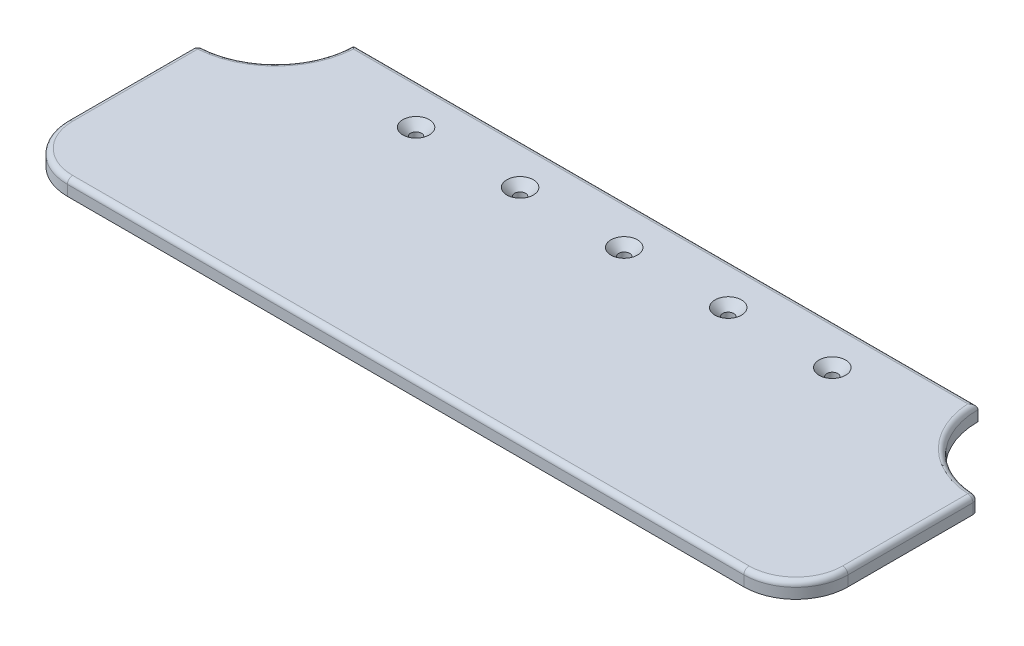
ISO-10303-21;
HEADER;
FILE_DESCRIPTION(('STEP AP214'),'2;1');
FILE_NAME('part.step','',(''),(''),'','','');
FILE_SCHEMA(('AUTOMOTIVE_DESIGN { 1 0 10303 214 1 1 1 1 }'));
ENDSEC;
DATA;
#1=APPLICATION_CONTEXT('core data for automotive mechanical design processes');
#2=APPLICATION_PROTOCOL_DEFINITION('international standard','automotive_design',2000,#1);
#3=PRODUCT_CONTEXT('',#1,'mechanical');
#4=PRODUCT('Part','Part','',(#3));
#5=PRODUCT_RELATED_PRODUCT_CATEGORY('part','',(#4));
#6=PRODUCT_DEFINITION_FORMATION('','',#4);
#7=PRODUCT_DEFINITION_CONTEXT('part definition',#1,'design');
#8=PRODUCT_DEFINITION('design','',#6,#7);
#9=PRODUCT_DEFINITION_SHAPE('','',#8);
#10=(LENGTH_UNIT() NAMED_UNIT(*) SI_UNIT(.MILLI.,.METRE.));
#11=(NAMED_UNIT(*) PLANE_ANGLE_UNIT() SI_UNIT($,.RADIAN.));
#12=(NAMED_UNIT(*) SI_UNIT($,.STERADIAN.) SOLID_ANGLE_UNIT());
#13=UNCERTAINTY_MEASURE_WITH_UNIT(LENGTH_MEASURE(1.E-05),#10,'distance_accuracy_value','');
#14=(GEOMETRIC_REPRESENTATION_CONTEXT(3) GLOBAL_UNCERTAINTY_ASSIGNED_CONTEXT((#13)) GLOBAL_UNIT_ASSIGNED_CONTEXT((#10,
#11,#12)) REPRESENTATION_CONTEXT('',''));
#15=CARTESIAN_POINT('',(0.,0.,0.));
#16=DIRECTION('',(0.,0.,1.));
#17=DIRECTION('',(1.,0.,0.));
#18=AXIS2_PLACEMENT_3D('',#15,#16,#17);
#19=CARTESIAN_POINT('',(-130.,6.,30.));
#20=DIRECTION('',(0.,-1.,0.));
#21=DIRECTION('',(0.,0.,-1.));
#22=AXIS2_PLACEMENT_3D('',#19,#20,#21);
#23=PLANE('',#22);
#24=CARTESIAN_POINT('',(-80.,6.,-33.9999999999994));
#25=DIRECTION('',(0.,-1.,0.));
#26=DIRECTION('',(0.,0.,-1.));
#27=AXIS2_PLACEMENT_3D('',#24,#25,#26);
#28=CIRCLE('',#27,5.10000000000002);
#29=CARTESIAN_POINT('',(-80.,6.,-39.0999999999995));
#30=VERTEX_POINT('',#29);
#31=EDGE_CURVE('E504',#30,#30,#28,.T.);
#32=ORIENTED_EDGE('',*,*,#31,.T.);
#33=EDGE_LOOP('',(#32));
#34=FACE_BOUND('',#33,.T.);
#35=CARTESIAN_POINT('',(-40.,6.,-33.9999999999997));
#36=DIRECTION('',(0.,-1.,0.));
#37=DIRECTION('',(0.,0.,-1.));
#38=AXIS2_PLACEMENT_3D('',#35,#36,#37);
#39=CIRCLE('',#38,5.10000000000002);
#40=CARTESIAN_POINT('',(-40.,6.,-39.0999999999997));
#41=VERTEX_POINT('',#40);
#42=EDGE_CURVE('E500',#41,#41,#39,.T.);
#43=ORIENTED_EDGE('',*,*,#42,.T.);
#44=EDGE_LOOP('',(#43));
#45=FACE_BOUND('',#44,.T.);
#46=CARTESIAN_POINT('',(0.,6.,-34.));
#47=DIRECTION('',(0.,-1.,0.));
#48=DIRECTION('',(0.,0.,-1.));
#49=AXIS2_PLACEMENT_3D('',#46,#47,#48);
#50=CIRCLE('',#49,5.10000000000002);
#51=CARTESIAN_POINT('',(0.,6.,-39.1));
#52=VERTEX_POINT('',#51);
#53=EDGE_CURVE('E496',#52,#52,#50,.T.);
#54=ORIENTED_EDGE('',*,*,#53,.T.);
#55=EDGE_LOOP('',(#54));
#56=FACE_BOUND('',#55,.T.);
#57=CARTESIAN_POINT('',(40.,6.,-34.));
#58=DIRECTION('',(0.,-1.,0.));
#59=DIRECTION('',(0.,0.,-1.));
#60=AXIS2_PLACEMENT_3D('',#57,#58,#59);
#61=CIRCLE('',#60,5.10000000000002);
#62=CARTESIAN_POINT('',(40.,6.,-39.1));
#63=VERTEX_POINT('',#62);
#64=EDGE_CURVE('E492',#63,#63,#61,.T.);
#65=ORIENTED_EDGE('',*,*,#64,.T.);
#66=EDGE_LOOP('',(#65));
#67=FACE_BOUND('',#66,.T.);
#68=CARTESIAN_POINT('',(80.,6.,-34.));
#69=DIRECTION('',(0.,-1.,0.));
#70=DIRECTION('',(0.,0.,-1.));
#71=AXIS2_PLACEMENT_3D('',#68,#69,#70);
#72=CIRCLE('',#71,5.10000000000002);
#73=CARTESIAN_POINT('',(80.,6.,-39.1));
#74=VERTEX_POINT('',#73);
#75=EDGE_CURVE('E488',#74,#74,#72,.T.);
#76=ORIENTED_EDGE('',*,*,#75,.T.);
#77=EDGE_LOOP('',(#76));
#78=FACE_BOUND('',#77,.T.);
#79=DIRECTION('',(-1.,0.,0.));
#80=VECTOR('',#79,1.);
#81=CARTESIAN_POINT('',(-130.,6.,-48.));
#82=LINE('',#81,#80);
#83=CARTESIAN_POINT('',(118.062561154657,6.,-48.));
#84=VERTEX_POINT('',#83);
#85=CARTESIAN_POINT('',(-118.062561154657,6.,-48.));
#86=VERTEX_POINT('',#85);
#87=EDGE_CURVE('E63',#84,#86,#82,.T.);
#88=ORIENTED_EDGE('',*,*,#87,.T.);
#89=CARTESIAN_POINT('',(-150.,6.,-50.));
#90=DIRECTION('',(0.,-1.,0.));
#91=DIRECTION('',(0.,0.,-1.));
#92=AXIS2_PLACEMENT_3D('',#89,#90,#91);
#93=CIRCLE('',#92,32.);
#94=CARTESIAN_POINT('',(-148.,6.,-18.0625611546574));
#95=VERTEX_POINT('',#94);
#96=EDGE_CURVE('E295',#86,#95,#93,.T.);
#97=ORIENTED_EDGE('',*,*,#96,.T.);
#98=DIRECTION('',(0.,0.,1.));
#99=VECTOR('',#98,1.);
#100=CARTESIAN_POINT('',(-148.,6.,30.));
#101=LINE('',#100,#99);
#102=CARTESIAN_POINT('',(-148.,6.,30.));
#103=VERTEX_POINT('',#102);
#104=EDGE_CURVE('E227',#95,#103,#101,.T.);
#105=ORIENTED_EDGE('',*,*,#104,.T.);
#106=CARTESIAN_POINT('',(-130.,6.,30.));
#107=DIRECTION('',(0.,-1.,0.));
#108=DIRECTION('',(0.,0.,-1.));
#109=AXIS2_PLACEMENT_3D('',#106,#107,#108);
#110=CIRCLE('',#109,18.);
#111=CARTESIAN_POINT('',(-130.,6.,48.));
#112=VERTEX_POINT('',#111);
#113=EDGE_CURVE('E224',#103,#112,#110,.F.);
#114=ORIENTED_EDGE('',*,*,#113,.T.);
#115=DIRECTION('',(1.,0.,0.));
#116=VECTOR('',#115,1.);
#117=CARTESIAN_POINT('',(-130.,6.,48.));
#118=LINE('',#117,#116);
#119=CARTESIAN_POINT('',(130.,6.,48.));
#120=VERTEX_POINT('',#119);
#121=EDGE_CURVE('E215',#112,#120,#118,.T.);
#122=ORIENTED_EDGE('',*,*,#121,.T.);
#123=CARTESIAN_POINT('',(130.,6.,30.));
#124=DIRECTION('',(0.,-1.,0.));
#125=DIRECTION('',(0.,0.,-1.));
#126=AXIS2_PLACEMENT_3D('',#123,#124,#125);
#127=CIRCLE('',#126,18.);
#128=CARTESIAN_POINT('',(148.,6.,30.));
#129=VERTEX_POINT('',#128);
#130=EDGE_CURVE('E218',#120,#129,#127,.F.);
#131=ORIENTED_EDGE('',*,*,#130,.T.);
#132=DIRECTION('',(0.,0.,-1.));
#133=VECTOR('',#132,1.);
#134=CARTESIAN_POINT('',(148.,6.,30.));
#135=LINE('',#134,#133);
#136=CARTESIAN_POINT('',(148.,6.,-18.0625611546574));
#137=VERTEX_POINT('',#136);
#138=EDGE_CURVE('E221',#129,#137,#135,.T.);
#139=ORIENTED_EDGE('',*,*,#138,.T.);
#140=CARTESIAN_POINT('',(150.,6.,-50.));
#141=DIRECTION('',(0.,-1.,0.));
#142=DIRECTION('',(0.,0.,-1.));
#143=AXIS2_PLACEMENT_3D('',#140,#141,#142);
#144=CIRCLE('',#143,32.);
#145=EDGE_CURVE('E68',#137,#84,#144,.T.);
#146=ORIENTED_EDGE('',*,*,#145,.T.);
#147=EDGE_LOOP('',(#88,#97,#105,#114,#122,#131,#139,#146));
#148=FACE_BOUND('',#147,.T.);
#149=ADVANCED_FACE('F46',(#34,#45,#56,#67,#78,#148),#23,.F.);
#150=CARTESIAN_POINT('',(-130.,0.,30.));
#151=DIRECTION('',(0.,-1.,0.));
#152=DIRECTION('',(0.,0.,-1.));
#153=AXIS2_PLACEMENT_3D('',#150,#151,#152);
#154=PLANE('',#153);
#155=DIRECTION('',(0.,0.,1.));
#156=VECTOR('',#155,1.);
#157=CARTESIAN_POINT('',(-150.,0.,30.));
#158=LINE('',#157,#156);
#159=CARTESIAN_POINT('',(-150.,0.,-18.0625611546574));
#160=VERTEX_POINT('',#159);
#161=CARTESIAN_POINT('',(-150.,0.,30.));
#162=VERTEX_POINT('',#161);
#163=EDGE_CURVE('E179',#160,#162,#158,.T.);
#164=ORIENTED_EDGE('',*,*,#163,.F.);
#165=CARTESIAN_POINT('',(-148.,0.,-18.0625611546574));
#166=DIRECTION('',(0.,-1.,0.));
#167=DIRECTION('',(0.,0.,-1.));
#168=AXIS2_PLACEMENT_3D('',#165,#166,#167);
#169=CIRCLE('',#168,2.);
#170=CARTESIAN_POINT('',(-148.125,0.,-20.0586510824913));
#171=VERTEX_POINT('',#170);
#172=EDGE_CURVE('E171',#160,#171,#169,.T.);
#173=ORIENTED_EDGE('',*,*,#172,.T.);
#174=CARTESIAN_POINT('',(-150.,0.,-50.));
#175=DIRECTION('',(0.,-1.,0.));
#176=DIRECTION('',(0.,0.,-1.));
#177=AXIS2_PLACEMENT_3D('',#174,#175,#176);
#178=CIRCLE('',#177,30.);
#179=CARTESIAN_POINT('',(-120.,0.,-50.));
#180=VERTEX_POINT('',#179);
#181=EDGE_CURVE('E153',#180,#171,#178,.T.);
#182=ORIENTED_EDGE('',*,*,#181,.F.);
#183=DIRECTION('',(-1.,0.,0.));
#184=VECTOR('',#183,1.);
#185=CARTESIAN_POINT('',(-150.,0.,-50.));
#186=LINE('',#185,#184);
#187=CARTESIAN_POINT('',(120.,0.,-50.));
#188=VERTEX_POINT('',#187);
#189=EDGE_CURVE('E169',#188,#180,#186,.T.);
#190=ORIENTED_EDGE('',*,*,#189,.F.);
#191=CARTESIAN_POINT('',(150.,0.,-50.));
#192=DIRECTION('',(0.,-1.,0.));
#193=DIRECTION('',(0.,0.,-1.));
#194=AXIS2_PLACEMENT_3D('',#191,#192,#193);
#195=CIRCLE('',#194,30.);
#196=CARTESIAN_POINT('',(148.125,0.,-20.0586510824913));
#197=VERTEX_POINT('',#196);
#198=EDGE_CURVE('E173',#197,#188,#195,.T.);
#199=ORIENTED_EDGE('',*,*,#198,.F.);
#200=CARTESIAN_POINT('',(148.,0.,-18.0625611546574));
#201=DIRECTION('',(0.,-1.,0.));
#202=DIRECTION('',(0.,0.,-1.));
#203=AXIS2_PLACEMENT_3D('',#200,#201,#202);
#204=CIRCLE('',#203,2.);
#205=CARTESIAN_POINT('',(150.,0.,-18.0625611546574));
#206=VERTEX_POINT('',#205);
#207=EDGE_CURVE('E271',#197,#206,#204,.T.);
#208=ORIENTED_EDGE('',*,*,#207,.T.);
#209=DIRECTION('',(0.,0.,-1.));
#210=VECTOR('',#209,1.);
#211=CARTESIAN_POINT('',(150.,0.,30.));
#212=LINE('',#211,#210);
#213=CARTESIAN_POINT('',(150.,0.,30.));
#214=VERTEX_POINT('',#213);
#215=EDGE_CURVE('E180',#214,#206,#212,.T.);
#216=ORIENTED_EDGE('',*,*,#215,.F.);
#217=CARTESIAN_POINT('',(130.,0.,30.));
#218=DIRECTION('',(0.,1.,0.));
#219=DIRECTION('',(0.,0.,1.));
#220=AXIS2_PLACEMENT_3D('',#217,#218,#219);
#221=CIRCLE('',#220,20.);
#222=CARTESIAN_POINT('',(130.,0.,50.));
#223=VERTEX_POINT('',#222);
#224=EDGE_CURVE('E198',#223,#214,#221,.T.);
#225=ORIENTED_EDGE('',*,*,#224,.F.);
#226=DIRECTION('',(1.,0.,0.));
#227=VECTOR('',#226,1.);
#228=CARTESIAN_POINT('',(-130.,0.,50.));
#229=LINE('',#228,#227);
#230=CARTESIAN_POINT('',(-130.,0.,50.));
#231=VERTEX_POINT('',#230);
#232=EDGE_CURVE('E194',#231,#223,#229,.T.);
#233=ORIENTED_EDGE('',*,*,#232,.F.);
#234=CARTESIAN_POINT('',(-130.,0.,30.));
#235=DIRECTION('',(0.,1.,0.));
#236=DIRECTION('',(0.,0.,-1.));
#237=AXIS2_PLACEMENT_3D('',#234,#235,#236);
#238=CIRCLE('',#237,20.);
#239=EDGE_CURVE('E184',#162,#231,#238,.T.);
#240=ORIENTED_EDGE('',*,*,#239,.F.);
#241=EDGE_LOOP('',(#164,#173,#182,#190,#199,#208,#216,#225,#233,#240));
#242=FACE_BOUND('',#241,.T.);
#243=CARTESIAN_POINT('',(-40.,0.,-33.9999999999997));
#244=DIRECTION('',(0.,1.,0.));
#245=DIRECTION('',(0.,0.,1.));
#246=AXIS2_PLACEMENT_3D('',#243,#244,#245);
#247=CIRCLE('',#246,2.1);
#248=CARTESIAN_POINT('',(-40.,0.,-31.8999999999997));
#249=VERTEX_POINT('',#248);
#250=EDGE_CURVE('E533',#249,#249,#247,.T.);
#251=ORIENTED_EDGE('',*,*,#250,.T.);
#252=EDGE_LOOP('',(#251));
#253=FACE_BOUND('',#252,.T.);
#254=CARTESIAN_POINT('',(40.,0.,-34.));
#255=DIRECTION('',(0.,1.,0.));
#256=DIRECTION('',(0.,0.,1.));
#257=AXIS2_PLACEMENT_3D('',#254,#255,#256);
#258=CIRCLE('',#257,2.1);
#259=CARTESIAN_POINT('',(40.,0.,-31.9));
#260=VERTEX_POINT('',#259);
#261=EDGE_CURVE('E524',#260,#260,#258,.T.);
#262=ORIENTED_EDGE('',*,*,#261,.T.);
#263=EDGE_LOOP('',(#262));
#264=FACE_BOUND('',#263,.T.);
#265=CARTESIAN_POINT('',(0.,0.,-34.));
#266=DIRECTION('',(0.,1.,0.));
#267=DIRECTION('',(0.,0.,1.));
#268=AXIS2_PLACEMENT_3D('',#265,#266,#267);
#269=CIRCLE('',#268,2.1);
#270=CARTESIAN_POINT('',(0.,0.,-31.9));
#271=VERTEX_POINT('',#270);
#272=EDGE_CURVE('E187',#271,#271,#269,.T.);
#273=ORIENTED_EDGE('',*,*,#272,.T.);
#274=EDGE_LOOP('',(#273));
#275=FACE_BOUND('',#274,.T.);
#276=CARTESIAN_POINT('',(80.,0.,-34.));
#277=DIRECTION('',(0.,1.,0.));
#278=DIRECTION('',(0.,0.,1.));
#279=AXIS2_PLACEMENT_3D('',#276,#277,#278);
#280=CIRCLE('',#279,2.1);
#281=CARTESIAN_POINT('',(80.,0.,-31.9));
#282=VERTEX_POINT('',#281);
#283=EDGE_CURVE('E527',#282,#282,#280,.T.);
#284=ORIENTED_EDGE('',*,*,#283,.T.);
#285=EDGE_LOOP('',(#284));
#286=FACE_BOUND('',#285,.T.);
#287=CARTESIAN_POINT('',(-80.,0.,-33.9999999999994));
#288=DIRECTION('',(0.,1.,0.));
#289=DIRECTION('',(0.,0.,1.));
#290=AXIS2_PLACEMENT_3D('',#287,#288,#289);
#291=CIRCLE('',#290,2.1);
#292=CARTESIAN_POINT('',(-80.,0.,-31.8999999999994));
#293=VERTEX_POINT('',#292);
#294=EDGE_CURVE('E262',#293,#293,#291,.T.);
#295=ORIENTED_EDGE('',*,*,#294,.T.);
#296=EDGE_LOOP('',(#295));
#297=FACE_BOUND('',#296,.T.);
#298=ADVANCED_FACE('F166',(#242,#253,#264,#275,#286,#297),#154,.T.);
#299=CARTESIAN_POINT('',(150.,6.,30.));
#300=DIRECTION('',(-1.,0.,0.));
#301=DIRECTION('',(0.,0.,1.));
#302=AXIS2_PLACEMENT_3D('',#299,#300,#301);
#303=PLANE('',#302);
#304=ORIENTED_EDGE('',*,*,#215,.T.);
#305=DIRECTION('',(0.,1.,0.));
#306=VECTOR('',#305,1.);
#307=CARTESIAN_POINT('',(150.,6.,-18.0625611546574));
#308=LINE('',#307,#306);
#309=CARTESIAN_POINT('',(150.,4.,-18.0625611546574));
#310=VERTEX_POINT('',#309);
#311=EDGE_CURVE('E279',#206,#310,#308,.T.);
#312=ORIENTED_EDGE('',*,*,#311,.T.);
#313=DIRECTION('',(0.,0.,-1.));
#314=VECTOR('',#313,1.);
#315=CARTESIAN_POINT('',(150.,4.,30.));
#316=LINE('',#315,#314);
#317=CARTESIAN_POINT('',(150.,4.,30.));
#318=VERTEX_POINT('',#317);
#319=EDGE_CURVE('E237',#310,#318,#316,.F.);
#320=ORIENTED_EDGE('',*,*,#319,.T.);
#321=DIRECTION('',(0.,-1.,0.));
#322=VECTOR('',#321,1.);
#323=CARTESIAN_POINT('',(150.,6.,30.));
#324=LINE('',#323,#322);
#325=EDGE_CURVE('E202',#318,#214,#324,.T.);
#326=ORIENTED_EDGE('',*,*,#325,.T.);
#327=EDGE_LOOP('',(#304,#312,#320,#326));
#328=FACE_BOUND('',#327,.T.);
#329=ADVANCED_FACE('F389',(#328),#303,.F.);
#330=CARTESIAN_POINT('',(-150.,6.,-50.));
#331=DIRECTION('',(0.,0.,1.));
#332=DIRECTION('',(1.,0.,0.));
#333=AXIS2_PLACEMENT_3D('',#330,#331,#332);
#334=PLANE('',#333);
#335=DIRECTION('',(0.,1.,0.));
#336=VECTOR('',#335,1.);
#337=CARTESIAN_POINT('',(-120.,-4.,-50.));
#338=LINE('',#337,#336);
#339=CARTESIAN_POINT('',(-120.,4.,-50.));
#340=VERTEX_POINT('',#339);
#341=EDGE_CURVE('E149',#180,#340,#338,.T.);
#342=ORIENTED_EDGE('',*,*,#341,.T.);
#343=DIRECTION('',(-1.,0.,0.));
#344=VECTOR('',#343,1.);
#345=CARTESIAN_POINT('',(-150.,4.,-50.));
#346=LINE('',#345,#344);
#347=CARTESIAN_POINT('',(120.,4.,-50.));
#348=VERTEX_POINT('',#347);
#349=EDGE_CURVE('E298',#340,#348,#346,.F.);
#350=ORIENTED_EDGE('',*,*,#349,.T.);
#351=DIRECTION('',(0.,1.,0.));
#352=VECTOR('',#351,1.);
#353=CARTESIAN_POINT('',(120.,-4.,-50.));
#354=LINE('',#353,#352);
#355=EDGE_CURVE('E161',#188,#348,#354,.T.);
#356=ORIENTED_EDGE('',*,*,#355,.F.);
#357=ORIENTED_EDGE('',*,*,#189,.T.);
#358=EDGE_LOOP('',(#342,#350,#356,#357));
#359=FACE_BOUND('',#358,.T.);
#360=ADVANCED_FACE('F176',(#359),#334,.F.);
#361=CARTESIAN_POINT('',(-150.,6.,30.));
#362=DIRECTION('',(1.,0.,0.));
#363=DIRECTION('',(0.,0.,-1.));
#364=AXIS2_PLACEMENT_3D('',#361,#362,#363);
#365=PLANE('',#364);
#366=DIRECTION('',(0.,0.,1.));
#367=VECTOR('',#366,1.);
#368=CARTESIAN_POINT('',(-150.,4.,30.));
#369=LINE('',#368,#367);
#370=CARTESIAN_POINT('',(-150.,4.,30.));
#371=VERTEX_POINT('',#370);
#372=CARTESIAN_POINT('',(-150.,4.,-18.0625611546574));
#373=VERTEX_POINT('',#372);
#374=EDGE_CURVE('E230',#371,#373,#369,.F.);
#375=ORIENTED_EDGE('',*,*,#374,.T.);
#376=DIRECTION('',(0.,1.,0.));
#377=VECTOR('',#376,1.);
#378=CARTESIAN_POINT('',(-150.,6.,-18.0625611546574));
#379=LINE('',#378,#377);
#380=EDGE_CURVE('E268',#373,#160,#379,.F.);
#381=ORIENTED_EDGE('',*,*,#380,.T.);
#382=ORIENTED_EDGE('',*,*,#163,.T.);
#383=DIRECTION('',(0.,-1.,0.));
#384=VECTOR('',#383,1.);
#385=CARTESIAN_POINT('',(-150.,6.,30.));
#386=LINE('',#385,#384);
#387=EDGE_CURVE('E211',#371,#162,#386,.T.);
#388=ORIENTED_EDGE('',*,*,#387,.F.);
#389=EDGE_LOOP('',(#375,#381,#382,#388));
#390=FACE_BOUND('',#389,.T.);
#391=ADVANCED_FACE('F408',(#390),#365,.F.);
#392=CARTESIAN_POINT('',(-130.,6.,30.));
#393=DIRECTION('',(0.,-1.,0.));
#394=DIRECTION('',(0.,0.,-1.));
#395=AXIS2_PLACEMENT_3D('',#392,#393,#394);
#396=CYLINDRICAL_SURFACE('',#395,20.);
#397=DIRECTION('',(0.,-1.,0.));
#398=VECTOR('',#397,1.);
#399=CARTESIAN_POINT('',(-130.,6.,50.));
#400=LINE('',#399,#398);
#401=CARTESIAN_POINT('',(-130.,4.,50.));
#402=VERTEX_POINT('',#401);
#403=EDGE_CURVE('E208',#402,#231,#400,.T.);
#404=ORIENTED_EDGE('',*,*,#403,.F.);
#405=CARTESIAN_POINT('',(-130.,4.,30.));
#406=DIRECTION('',(0.,-1.,0.));
#407=DIRECTION('',(0.,0.,-1.));
#408=AXIS2_PLACEMENT_3D('',#405,#406,#407);
#409=CIRCLE('',#408,20.);
#410=EDGE_CURVE('E234',#402,#371,#409,.T.);
#411=ORIENTED_EDGE('',*,*,#410,.T.);
#412=ORIENTED_EDGE('',*,*,#387,.T.);
#413=ORIENTED_EDGE('',*,*,#239,.T.);
#414=EDGE_LOOP('',(#404,#411,#412,#413));
#415=FACE_BOUND('',#414,.T.);
#416=ADVANCED_FACE('F404',(#415),#396,.T.);
#417=CARTESIAN_POINT('',(-130.,6.,50.));
#418=DIRECTION('',(0.,0.,-1.));
#419=DIRECTION('',(-1.,0.,0.));
#420=AXIS2_PLACEMENT_3D('',#417,#418,#419);
#421=PLANE('',#420);
#422=DIRECTION('',(0.,-1.,0.));
#423=VECTOR('',#422,1.);
#424=CARTESIAN_POINT('',(130.,6.,50.));
#425=LINE('',#424,#423);
#426=CARTESIAN_POINT('',(130.,4.,50.));
#427=VERTEX_POINT('',#426);
#428=EDGE_CURVE('E205',#427,#223,#425,.T.);
#429=ORIENTED_EDGE('',*,*,#428,.F.);
#430=DIRECTION('',(1.,0.,0.));
#431=VECTOR('',#430,1.);
#432=CARTESIAN_POINT('',(-130.,4.,50.));
#433=LINE('',#432,#431);
#434=EDGE_CURVE('E243',#427,#402,#433,.F.);
#435=ORIENTED_EDGE('',*,*,#434,.T.);
#436=ORIENTED_EDGE('',*,*,#403,.T.);
#437=ORIENTED_EDGE('',*,*,#232,.T.);
#438=EDGE_LOOP('',(#429,#435,#436,#437));
#439=FACE_BOUND('',#438,.T.);
#440=ADVANCED_FACE('F400',(#439),#421,.F.);
#441=CARTESIAN_POINT('',(130.,6.,30.));
#442=DIRECTION('',(0.,-1.,0.));
#443=DIRECTION('',(0.,0.,-1.));
#444=AXIS2_PLACEMENT_3D('',#441,#442,#443);
#445=CYLINDRICAL_SURFACE('',#444,20.);
#446=ORIENTED_EDGE('',*,*,#325,.F.);
#447=CARTESIAN_POINT('',(130.,4.,30.));
#448=DIRECTION('',(0.,-1.,0.));
#449=DIRECTION('',(0.,0.,-1.));
#450=AXIS2_PLACEMENT_3D('',#447,#448,#449);
#451=CIRCLE('',#450,20.);
#452=EDGE_CURVE('E240',#318,#427,#451,.T.);
#453=ORIENTED_EDGE('',*,*,#452,.T.);
#454=ORIENTED_EDGE('',*,*,#428,.T.);
#455=ORIENTED_EDGE('',*,*,#224,.T.);
#456=EDGE_LOOP('',(#446,#453,#454,#455));
#457=FACE_BOUND('',#456,.T.);
#458=ADVANCED_FACE('F397',(#457),#445,.T.);
#459=CARTESIAN_POINT('',(0.,6.,-34.));
#460=DIRECTION('',(0.,-1.,0.));
#461=DIRECTION('',(0.,0.,-1.));
#462=AXIS2_PLACEMENT_3D('',#459,#460,#461);
#463=CYLINDRICAL_SURFACE('',#462,2.1);
#464=CARTESIAN_POINT('',(0.,3.,-34.));
#465=DIRECTION('',(0.,-1.,0.));
#466=DIRECTION('',(0.,0.,-1.));
#467=AXIS2_PLACEMENT_3D('',#464,#465,#466);
#468=CIRCLE('',#467,2.1);
#469=CARTESIAN_POINT('',(0.,3.,-36.1));
#470=VERTEX_POINT('',#469);
#471=EDGE_CURVE('E511',#470,#470,#468,.F.);
#472=ORIENTED_EDGE('',*,*,#471,.T.);
#473=EDGE_LOOP('',(#472));
#474=FACE_BOUND('',#473,.T.);
#475=ORIENTED_EDGE('',*,*,#272,.F.);
#476=EDGE_LOOP('',(#475));
#477=FACE_BOUND('',#476,.T.);
#478=ADVANCED_FACE('F394',(#474,#477),#463,.F.);
#479=CARTESIAN_POINT('',(40.,6.,-34.));
#480=DIRECTION('',(0.,-1.,0.));
#481=DIRECTION('',(0.,0.,-1.));
#482=AXIS2_PLACEMENT_3D('',#479,#480,#481);
#483=CYLINDRICAL_SURFACE('',#482,2.1);
#484=CARTESIAN_POINT('',(40.,3.,-34.));
#485=DIRECTION('',(0.,-1.,0.));
#486=DIRECTION('',(0.,0.,-1.));
#487=AXIS2_PLACEMENT_3D('',#484,#485,#486);
#488=CIRCLE('',#487,2.1);
#489=CARTESIAN_POINT('',(40.,3.,-36.1));
#490=VERTEX_POINT('',#489);
#491=EDGE_CURVE('E56',#490,#490,#488,.F.);
#492=ORIENTED_EDGE('',*,*,#491,.T.);
#493=EDGE_LOOP('',(#492));
#494=FACE_BOUND('',#493,.T.);
#495=ORIENTED_EDGE('',*,*,#261,.F.);
#496=EDGE_LOOP('',(#495));
#497=FACE_BOUND('',#496,.T.);
#498=ADVANCED_FACE('F518',(#494,#497),#483,.F.);
#499=CARTESIAN_POINT('',(80.,6.,-34.));
#500=DIRECTION('',(0.,-1.,0.));
#501=DIRECTION('',(0.,0.,-1.));
#502=AXIS2_PLACEMENT_3D('',#499,#500,#501);
#503=CYLINDRICAL_SURFACE('',#502,2.1);
#504=CARTESIAN_POINT('',(80.,3.,-34.));
#505=DIRECTION('',(0.,-1.,0.));
#506=DIRECTION('',(0.,0.,-1.));
#507=AXIS2_PLACEMENT_3D('',#504,#505,#506);
#508=CIRCLE('',#507,2.1);
#509=CARTESIAN_POINT('',(80.,3.,-36.1));
#510=VERTEX_POINT('',#509);
#511=EDGE_CURVE('E11',#510,#510,#508,.F.);
#512=ORIENTED_EDGE('',*,*,#511,.T.);
#513=EDGE_LOOP('',(#512));
#514=FACE_BOUND('',#513,.T.);
#515=ORIENTED_EDGE('',*,*,#283,.F.);
#516=EDGE_LOOP('',(#515));
#517=FACE_BOUND('',#516,.T.);
#518=ADVANCED_FACE('F521',(#514,#517),#503,.F.);
#519=CARTESIAN_POINT('',(-40.,6.,-33.9999999999997));
#520=DIRECTION('',(0.,-1.,0.));
#521=DIRECTION('',(0.,0.,-1.));
#522=AXIS2_PLACEMENT_3D('',#519,#520,#521);
#523=CYLINDRICAL_SURFACE('',#522,2.1);
#524=CARTESIAN_POINT('',(-40.,3.,-33.9999999999997));
#525=DIRECTION('',(0.,-1.,0.));
#526=DIRECTION('',(0.,0.,-1.));
#527=AXIS2_PLACEMENT_3D('',#524,#525,#526);
#528=CIRCLE('',#527,2.1);
#529=CARTESIAN_POINT('',(-40.,3.,-36.0999999999997));
#530=VERTEX_POINT('',#529);
#531=EDGE_CURVE('E507',#530,#530,#528,.F.);
#532=ORIENTED_EDGE('',*,*,#531,.T.);
#533=EDGE_LOOP('',(#532));
#534=FACE_BOUND('',#533,.T.);
#535=ORIENTED_EDGE('',*,*,#250,.F.);
#536=EDGE_LOOP('',(#535));
#537=FACE_BOUND('',#536,.T.);
#538=ADVANCED_FACE('F547',(#534,#537),#523,.F.);
#539=CARTESIAN_POINT('',(-80.,6.,-33.9999999999994));
#540=DIRECTION('',(0.,-1.,0.));
#541=DIRECTION('',(0.,0.,-1.));
#542=AXIS2_PLACEMENT_3D('',#539,#540,#541);
#543=CYLINDRICAL_SURFACE('',#542,2.1);
#544=CARTESIAN_POINT('',(-80.,3.,-33.9999999999994));
#545=DIRECTION('',(0.,-1.,0.));
#546=DIRECTION('',(0.,0.,-1.));
#547=AXIS2_PLACEMENT_3D('',#544,#545,#546);
#548=CIRCLE('',#547,2.1);
#549=CARTESIAN_POINT('',(-80.,3.,-36.0999999999994));
#550=VERTEX_POINT('',#549);
#551=EDGE_CURVE('E301',#550,#550,#548,.F.);
#552=ORIENTED_EDGE('',*,*,#551,.T.);
#553=EDGE_LOOP('',(#552));
#554=FACE_BOUND('',#553,.T.);
#555=ORIENTED_EDGE('',*,*,#294,.F.);
#556=EDGE_LOOP('',(#555));
#557=FACE_BOUND('',#556,.T.);
#558=ADVANCED_FACE('F437',(#554,#557),#543,.F.);
#559=CARTESIAN_POINT('',(148.,4.,30.));
#560=DIRECTION('',(0.,0.,-1.));
#561=DIRECTION('',(-1.,0.,0.));
#562=AXIS2_PLACEMENT_3D('',#559,#560,#561);
#563=CYLINDRICAL_SURFACE('',#562,2.);
#564=ORIENTED_EDGE('',*,*,#319,.F.);
#565=CARTESIAN_POINT('',(148.,4.,-18.0625611546574));
#566=DIRECTION('',(0.,0.,-1.));
#567=DIRECTION('',(-1.,0.,0.));
#568=AXIS2_PLACEMENT_3D('',#565,#566,#567);
#569=CIRCLE('',#568,2.);
#570=EDGE_CURVE('E288',#310,#137,#569,.F.);
#571=ORIENTED_EDGE('',*,*,#570,.T.);
#572=ORIENTED_EDGE('',*,*,#138,.F.);
#573=CARTESIAN_POINT('',(148.,4.,30.));
#574=DIRECTION('',(0.,0.,1.));
#575=DIRECTION('',(1.,0.,0.));
#576=AXIS2_PLACEMENT_3D('',#573,#574,#575);
#577=CIRCLE('',#576,2.);
#578=EDGE_CURVE('E258',#318,#129,#577,.T.);
#579=ORIENTED_EDGE('',*,*,#578,.F.);
#580=EDGE_LOOP('',(#564,#571,#572,#579));
#581=FACE_BOUND('',#580,.T.);
#582=ADVANCED_FACE('F433',(#581),#563,.T.);
#583=CARTESIAN_POINT('',(130.,4.,30.));
#584=DIRECTION('',(0.,-1.,0.));
#585=DIRECTION('',(0.,0.,-1.));
#586=AXIS2_PLACEMENT_3D('',#583,#584,#585);
#587=TOROIDAL_SURFACE('',#586,18.,2.);
#588=ORIENTED_EDGE('',*,*,#578,.T.);
#589=ORIENTED_EDGE('',*,*,#130,.F.);
#590=CARTESIAN_POINT('',(130.,4.,48.));
#591=DIRECTION('',(-1.,0.,0.));
#592=DIRECTION('',(0.,0.,1.));
#593=AXIS2_PLACEMENT_3D('',#590,#591,#592);
#594=CIRCLE('',#593,2.);
#595=EDGE_CURVE('E254',#427,#120,#594,.T.);
#596=ORIENTED_EDGE('',*,*,#595,.F.);
#597=ORIENTED_EDGE('',*,*,#452,.F.);
#598=EDGE_LOOP('',(#588,#589,#596,#597));
#599=FACE_BOUND('',#598,.T.);
#600=ADVANCED_FACE('F429',(#599),#587,.T.);
#601=CARTESIAN_POINT('',(-130.,4.,48.));
#602=DIRECTION('',(1.,0.,0.));
#603=DIRECTION('',(0.,0.,-1.));
#604=AXIS2_PLACEMENT_3D('',#601,#602,#603);
#605=CYLINDRICAL_SURFACE('',#604,2.);
#606=ORIENTED_EDGE('',*,*,#595,.T.);
#607=ORIENTED_EDGE('',*,*,#121,.F.);
#608=CARTESIAN_POINT('',(-130.,4.,48.));
#609=DIRECTION('',(-1.,0.,0.));
#610=DIRECTION('',(0.,0.,1.));
#611=AXIS2_PLACEMENT_3D('',#608,#609,#610);
#612=CIRCLE('',#611,2.);
#613=EDGE_CURVE('E250',#402,#112,#612,.T.);
#614=ORIENTED_EDGE('',*,*,#613,.F.);
#615=ORIENTED_EDGE('',*,*,#434,.F.);
#616=EDGE_LOOP('',(#606,#607,#614,#615));
#617=FACE_BOUND('',#616,.T.);
#618=ADVANCED_FACE('F425',(#617),#605,.T.);
#619=CARTESIAN_POINT('',(-130.,4.,30.));
#620=DIRECTION('',(0.,-1.,0.));
#621=DIRECTION('',(0.,0.,-1.));
#622=AXIS2_PLACEMENT_3D('',#619,#620,#621);
#623=TOROIDAL_SURFACE('',#622,18.,2.);
#624=ORIENTED_EDGE('',*,*,#613,.T.);
#625=ORIENTED_EDGE('',*,*,#113,.F.);
#626=CARTESIAN_POINT('',(-148.,4.,30.));
#627=DIRECTION('',(0.,0.,-1.));
#628=DIRECTION('',(-1.,0.,0.));
#629=AXIS2_PLACEMENT_3D('',#626,#627,#628);
#630=CIRCLE('',#629,2.);
#631=EDGE_CURVE('E246',#371,#103,#630,.T.);
#632=ORIENTED_EDGE('',*,*,#631,.F.);
#633=ORIENTED_EDGE('',*,*,#410,.F.);
#634=EDGE_LOOP('',(#624,#625,#632,#633));
#635=FACE_BOUND('',#634,.T.);
#636=ADVANCED_FACE('F421',(#635),#623,.T.);
#637=CARTESIAN_POINT('',(-148.,4.,30.));
#638=DIRECTION('',(0.,0.,1.));
#639=DIRECTION('',(1.,0.,0.));
#640=AXIS2_PLACEMENT_3D('',#637,#638,#639);
#641=CYLINDRICAL_SURFACE('',#640,2.);
#642=ORIENTED_EDGE('',*,*,#104,.F.);
#643=CARTESIAN_POINT('',(-148.,4.,-18.0625611546574));
#644=DIRECTION('',(0.,0.,1.));
#645=DIRECTION('',(1.,0.,0.));
#646=AXIS2_PLACEMENT_3D('',#643,#644,#645);
#647=CIRCLE('',#646,2.);
#648=EDGE_CURVE('E276',#95,#373,#647,.T.);
#649=ORIENTED_EDGE('',*,*,#648,.T.);
#650=ORIENTED_EDGE('',*,*,#374,.F.);
#651=ORIENTED_EDGE('',*,*,#631,.T.);
#652=EDGE_LOOP('',(#642,#649,#650,#651));
#653=FACE_BOUND('',#652,.T.);
#654=ADVANCED_FACE('F418',(#653),#641,.T.);
#655=CARTESIAN_POINT('',(-150.,-4.,-50.));
#656=DIRECTION('',(0.,1.,0.));
#657=DIRECTION('',(0.,0.,1.));
#658=AXIS2_PLACEMENT_3D('',#655,#656,#657);
#659=CYLINDRICAL_SURFACE('',#658,30.);
#660=ORIENTED_EDGE('',*,*,#181,.T.);
#661=DIRECTION('',(0.,1.,0.));
#662=VECTOR('',#661,1.);
#663=CARTESIAN_POINT('',(-148.125,-4.,-20.0586510824913));
#664=LINE('',#663,#662);
#665=CARTESIAN_POINT('',(-148.125,4.,-20.0586510824913));
#666=VERTEX_POINT('',#665);
#667=EDGE_CURVE('E265',#171,#666,#664,.T.);
#668=ORIENTED_EDGE('',*,*,#667,.T.);
#669=CARTESIAN_POINT('',(-150.,4.,-50.));
#670=DIRECTION('',(0.,-1.,0.));
#671=DIRECTION('',(0.,0.,-1.));
#672=AXIS2_PLACEMENT_3D('',#669,#670,#671);
#673=CIRCLE('',#672,30.);
#674=EDGE_CURVE('E156',#666,#340,#673,.F.);
#675=ORIENTED_EDGE('',*,*,#674,.T.);
#676=ORIENTED_EDGE('',*,*,#341,.F.);
#677=EDGE_LOOP('',(#660,#668,#675,#676));
#678=FACE_BOUND('',#677,.T.);
#679=ADVANCED_FACE('F151',(#678),#659,.F.);
#680=CARTESIAN_POINT('',(150.,-4.,-50.));
#681=DIRECTION('',(0.,1.,0.));
#682=DIRECTION('',(0.,0.,1.));
#683=AXIS2_PLACEMENT_3D('',#680,#681,#682);
#684=CYLINDRICAL_SURFACE('',#683,30.);
#685=CARTESIAN_POINT('',(150.,4.,-50.));
#686=DIRECTION('',(0.,-1.,0.));
#687=DIRECTION('',(0.,0.,-1.));
#688=AXIS2_PLACEMENT_3D('',#685,#686,#687);
#689=CIRCLE('',#688,30.);
#690=CARTESIAN_POINT('',(148.125,4.,-20.0586510824913));
#691=VERTEX_POINT('',#690);
#692=EDGE_CURVE('E282',#348,#691,#689,.F.);
#693=ORIENTED_EDGE('',*,*,#692,.T.);
#694=DIRECTION('',(0.,1.,0.));
#695=VECTOR('',#694,1.);
#696=CARTESIAN_POINT('',(148.125,-4.,-20.0586510824913));
#697=LINE('',#696,#695);
#698=EDGE_CURVE('E285',#691,#197,#697,.F.);
#699=ORIENTED_EDGE('',*,*,#698,.T.);
#700=ORIENTED_EDGE('',*,*,#198,.T.);
#701=ORIENTED_EDGE('',*,*,#355,.T.);
#702=EDGE_LOOP('',(#693,#699,#700,#701));
#703=FACE_BOUND('',#702,.T.);
#704=ADVANCED_FACE('F346',(#703),#684,.F.);
#705=CARTESIAN_POINT('',(148.,-4.,-18.0625611546574));
#706=DIRECTION('',(0.,1.,0.));
#707=DIRECTION('',(0.,0.,1.));
#708=AXIS2_PLACEMENT_3D('',#705,#706,#707);
#709=CYLINDRICAL_SURFACE('',#708,2.);
#710=CARTESIAN_POINT('',(148.,4.,-18.0625611546574));
#711=DIRECTION('',(0.,1.,0.));
#712=DIRECTION('',(0.,0.,1.));
#713=AXIS2_PLACEMENT_3D('',#710,#711,#712);
#714=CIRCLE('',#713,2.);
#715=EDGE_CURVE('E473',#310,#691,#714,.T.);
#716=ORIENTED_EDGE('',*,*,#715,.F.);
#717=ORIENTED_EDGE('',*,*,#311,.F.);
#718=ORIENTED_EDGE('',*,*,#207,.F.);
#719=ORIENTED_EDGE('',*,*,#698,.F.);
#720=EDGE_LOOP('',(#716,#717,#718,#719));
#721=FACE_BOUND('',#720,.T.);
#722=ADVANCED_FACE('F342',(#721),#709,.T.);
#723=CARTESIAN_POINT('',(148.,4.,-18.0625611546574));
#724=DIRECTION('',(-0.0624999999999992,0.,0.998044963916957));
#725=DIRECTION('',(0.998044963916957,0.,0.0624999999999992));
#726=AXIS2_PLACEMENT_3D('',#723,#724,#725);
#727=SPHERICAL_SURFACE('',#726,2.);
#728=ORIENTED_EDGE('',*,*,#570,.F.);
#729=ORIENTED_EDGE('',*,*,#715,.T.);
#730=CARTESIAN_POINT('',(148.,4.,-18.0625611546574));
#731=DIRECTION('',(-0.998044963916957,0.,-0.062499999999993));
#732=DIRECTION('',(-0.0624999999999931,0.,0.998044963916958));
#733=AXIS2_PLACEMENT_3D('',#730,#731,#732);
#734=CIRCLE('',#733,2.);
#735=EDGE_CURVE('E477',#137,#691,#734,.T.);
#736=ORIENTED_EDGE('',*,*,#735,.F.);
#737=EDGE_LOOP('',(#728,#729,#736));
#738=FACE_BOUND('',#737,.T.);
#739=ADVANCED_FACE('F338',(#738),#727,.T.);
#740=CARTESIAN_POINT('',(150.,4.,-50.));
#741=DIRECTION('',(0.,-1.,0.));
#742=DIRECTION('',(0.,0.,-1.));
#743=AXIS2_PLACEMENT_3D('',#740,#741,#742);
#744=TOROIDAL_SURFACE('',#743,32.,2.);
#745=ORIENTED_EDGE('',*,*,#735,.T.);
#746=ORIENTED_EDGE('',*,*,#692,.F.);
#747=CARTESIAN_POINT('',(120.,4.,-50.));
#748=CARTESIAN_POINT('',(120.000011769919,4.04498002359406,-50.0000113030667));
#749=CARTESIAN_POINT('',(119.998483002001,4.08995110951132,-49.9984829925544));
#750=CARTESIAN_POINT('',(119.992435004753,4.17945373494195,-49.9924343268917));
#751=CARTESIAN_POINT('',(119.98791819825,4.22398560092739,-49.9879163958513));
#752=CARTESIAN_POINT('',(119.976036187798,4.31187964651881,-49.9760271631533));
#753=CARTESIAN_POINT('',(119.968696011779,4.35524861891634,-49.9686809326159));
#754=CARTESIAN_POINT('',(119.95132794798,4.44088581588376,-49.9512897257759));
#755=CARTESIAN_POINT('',(119.941299658152,4.48315387475809,-49.9412443457768));
#756=CARTESIAN_POINT('',(119.907527653037,4.60762480076446,-49.907393573951));
#757=CARTESIAN_POINT('',(119.880047755498,4.68784112661332,-49.8798245862243));
#758=CARTESIAN_POINT('',(119.816827469299,4.84146413558813,-49.816284933315));
#759=CARTESIAN_POINT('',(119.781067913245,4.9148544552439,-49.7802947710535));
#760=CARTESIAN_POINT('',(119.686776404461,5.08301907501059,-49.685191694173));
#761=CARTESIAN_POINT('',(119.624952180664,5.17403046009687,-49.6226808366095));
#762=CARTESIAN_POINT('',(119.492117186645,5.34079277556643,-49.4878921448282));
#763=CARTESIAN_POINT('',(119.42108885949,5.41651381447889,-49.4155956323121));
#764=CARTESIAN_POINT('',(119.245246231613,5.57862850769173,-49.2359233108422));
#765=CARTESIAN_POINT('',(119.13766008085,5.6585923064142,-49.1254706392108));
#766=CARTESIAN_POINT('',(118.915671899159,5.79285900354551,-48.8962820384652));
#767=CARTESIAN_POINT('',(118.801263136827,5.8471360706802,-48.7775379083179));
#768=CARTESIAN_POINT('',(118.583838855547,5.92597411809034,-48.5505850914855));
#769=CARTESIAN_POINT('',(118.481234288715,5.95344488411608,-48.4429676150742));
#770=CARTESIAN_POINT('',(118.275196657482,5.99025422845783,-48.2257904969934));
#771=CARTESIAN_POINT('',(118.171765841342,5.99963156042117,-48.1162355146175));
#772=CARTESIAN_POINT('',(118.066647700209,5.99999644850452,-48.0043502524935));
#773=CARTESIAN_POINT('',(118.064604354016,5.99999999683003,-48.0021751531405));
#774=CARTESIAN_POINT('',(118.062561154657,6.,-48.));
#775=B_SPLINE_CURVE_WITH_KNOTS('',3,(#747,#748,#749,#750,#751,#752,#753,#754,#755,#756,#757,
#758,#759,#760,#761,#762,#763,#764,#765,#766,#767,#768,#769,#770,#771,#772,#773,#774),
.UNSPECIFIED.,.F.,.F.,(4,2,2,2,2,2,2,2,2,2,2,2,2,4),(0.,0.134873620115743,0.269638012818522,
0.403234329709009,0.536850638975578,0.80303682137535,1.06984549687555,1.44736370103669,
1.82561292820712,2.34391866335536,2.86274451903484,3.31531129484967,3.766907654126,
3.77586068840251),.UNSPECIFIED.);
#776=EDGE_CURVE('E319',#84,#348,#775,.F.);
#777=ORIENTED_EDGE('',*,*,#776,.F.);
#778=ORIENTED_EDGE('',*,*,#145,.F.);
#779=EDGE_LOOP('',(#745,#746,#777,#778));
#780=FACE_BOUND('',#779,.T.);
#781=ADVANCED_FACE('F334',(#780),#744,.T.);
#782=CARTESIAN_POINT('',(-130.,4.,-48.));
#783=DIRECTION('',(-1.,0.,0.));
#784=DIRECTION('',(0.,0.,1.));
#785=AXIS2_PLACEMENT_3D('',#782,#783,#784);
#786=CYLINDRICAL_SURFACE('',#785,2.);
#787=ORIENTED_EDGE('',*,*,#776,.T.);
#788=ORIENTED_EDGE('',*,*,#349,.F.);
#789=CARTESIAN_POINT('',(-120.,4.,-50.));
#790=CARTESIAN_POINT('',(-120.000011769919,4.04498002359406,-50.0000113030667));
#791=CARTESIAN_POINT('',(-119.998483002001,4.08995110951133,-49.9984829925544));
#792=CARTESIAN_POINT('',(-119.992435004753,4.17945373494195,-49.9924343268917));
#793=CARTESIAN_POINT('',(-119.987918198249,4.22398560092739,-49.9879163958513));
#794=CARTESIAN_POINT('',(-119.976036187797,4.31187964651881,-49.9760271631533));
#795=CARTESIAN_POINT('',(-119.968696011779,4.35524861891634,-49.9686809326159));
#796=CARTESIAN_POINT('',(-119.95132794798,4.44088581588376,-49.9512897257759));
#797=CARTESIAN_POINT('',(-119.941299658152,4.48315387475809,-49.9412443457768));
#798=CARTESIAN_POINT('',(-119.907527653037,4.60762480076446,-49.907393573951));
#799=CARTESIAN_POINT('',(-119.880047755498,4.68784112661332,-49.8798245862243));
#800=CARTESIAN_POINT('',(-119.816827469299,4.84146413558813,-49.816284933315));
#801=CARTESIAN_POINT('',(-119.781067913245,4.9148544552439,-49.7802947710535));
#802=CARTESIAN_POINT('',(-119.686776404461,5.08301907501059,-49.685191694173));
#803=CARTESIAN_POINT('',(-119.624952180664,5.17403046009687,-49.6226808366095));
#804=CARTESIAN_POINT('',(-119.492117186645,5.34079277556643,-49.4878921448282));
#805=CARTESIAN_POINT('',(-119.42108885949,5.41651381447889,-49.4155956323121));
#806=CARTESIAN_POINT('',(-119.245246231613,5.57862850769173,-49.2359233108422));
#807=CARTESIAN_POINT('',(-119.13766008085,5.6585923064142,-49.1254706392108));
#808=CARTESIAN_POINT('',(-118.915671899159,5.79285900354551,-48.8962820384652));
#809=CARTESIAN_POINT('',(-118.801263136827,5.8471360706802,-48.7775379083179));
#810=CARTESIAN_POINT('',(-118.583838855547,5.92597411809034,-48.5505850914855));
#811=CARTESIAN_POINT('',(-118.481234288715,5.95344488411608,-48.4429676150742));
#812=CARTESIAN_POINT('',(-118.275196657482,5.99025422845783,-48.2257904969934));
#813=CARTESIAN_POINT('',(-118.171765841342,5.99963156042117,-48.1162355146175));
#814=CARTESIAN_POINT('',(-118.066647700209,5.99999644850452,-48.0043502524935));
#815=CARTESIAN_POINT('',(-118.064604354016,5.99999999683003,-48.0021751531405));
#816=CARTESIAN_POINT('',(-118.062561154657,6.,-48.));
#817=B_SPLINE_CURVE_WITH_KNOTS('',3,(#789,#790,#791,#792,#793,#794,#795,#796,#797,#798,#799,
#800,#801,#802,#803,#804,#805,#806,#807,#808,#809,#810,#811,#812,#813,#814,#815,#816),
.UNSPECIFIED.,.F.,.F.,(4,2,2,2,2,2,2,2,2,2,2,2,2,4),(0.,0.134873620115745,0.269638012818522,
0.403234329709009,0.536850638975577,0.803036821375347,1.06984549687555,1.44736370103669,
1.82561292820712,2.34391866335536,2.86274451903484,3.31531129484966,3.766907654126,
3.7758606884025),.UNSPECIFIED.);
#818=EDGE_CURVE('E309',#86,#340,#817,.F.);
#819=ORIENTED_EDGE('',*,*,#818,.F.);
#820=ORIENTED_EDGE('',*,*,#87,.F.);
#821=EDGE_LOOP('',(#787,#788,#819,#820));
#822=FACE_BOUND('',#821,.T.);
#823=ADVANCED_FACE('F326',(#822),#786,.T.);
#824=CARTESIAN_POINT('',(-150.,4.,-50.));
#825=DIRECTION('',(0.,-1.,0.));
#826=DIRECTION('',(0.,0.,-1.));
#827=AXIS2_PLACEMENT_3D('',#824,#825,#826);
#828=TOROIDAL_SURFACE('',#827,32.,2.);
#829=CARTESIAN_POINT('',(-148.,4.,-18.0625611546574));
#830=DIRECTION('',(-0.998044963916957,0.,0.0624999999999932));
#831=DIRECTION('',(0.0624999999999932,0.,0.998044963916958));
#832=AXIS2_PLACEMENT_3D('',#829,#830,#831);
#833=CIRCLE('',#832,2.);
#834=EDGE_CURVE('E305',#95,#666,#833,.T.);
#835=ORIENTED_EDGE('',*,*,#834,.F.);
#836=ORIENTED_EDGE('',*,*,#96,.F.);
#837=ORIENTED_EDGE('',*,*,#818,.T.);
#838=ORIENTED_EDGE('',*,*,#674,.F.);
#839=EDGE_LOOP('',(#835,#836,#837,#838));
#840=FACE_BOUND('',#839,.T.);
#841=ADVANCED_FACE('F329',(#840),#828,.T.);
#842=CARTESIAN_POINT('',(-148.,4.,-18.0625611546574));
#843=DIRECTION('',(0.0625000000000001,0.,0.998044963916957));
#844=DIRECTION('',(0.998044963916957,0.,-0.0625000000000001));
#845=AXIS2_PLACEMENT_3D('',#842,#843,#844);
#846=SPHERICAL_SURFACE('',#845,2.);
#847=ORIENTED_EDGE('',*,*,#648,.F.);
#848=ORIENTED_EDGE('',*,*,#834,.T.);
#849=CARTESIAN_POINT('',(-148.,4.,-18.0625611546574));
#850=DIRECTION('',(0.,-1.,0.));
#851=DIRECTION('',(0.,0.,-1.));
#852=AXIS2_PLACEMENT_3D('',#849,#850,#851);
#853=CIRCLE('',#852,2.);
#854=EDGE_CURVE('E302',#373,#666,#853,.T.);
#855=ORIENTED_EDGE('',*,*,#854,.F.);
#856=EDGE_LOOP('',(#847,#848,#855));
#857=FACE_BOUND('',#856,.T.);
#858=ADVANCED_FACE('F332',(#857),#846,.T.);
#859=CARTESIAN_POINT('',(-148.,-4.,-18.0625611546574));
#860=DIRECTION('',(0.,1.,0.));
#861=DIRECTION('',(0.,0.,1.));
#862=AXIS2_PLACEMENT_3D('',#859,#860,#861);
#863=CYLINDRICAL_SURFACE('',#862,2.);
#864=ORIENTED_EDGE('',*,*,#172,.F.);
#865=ORIENTED_EDGE('',*,*,#380,.F.);
#866=ORIENTED_EDGE('',*,*,#854,.T.);
#867=ORIENTED_EDGE('',*,*,#667,.F.);
#868=EDGE_LOOP('',(#864,#865,#866,#867));
#869=FACE_BOUND('',#868,.T.);
#870=ADVANCED_FACE('F356',(#869),#863,.T.);
#871=CARTESIAN_POINT('',(-80.,3.,-33.9999999999994));
#872=DIRECTION('',(0.,1.,0.));
#873=DIRECTION('',(0.,0.,1.));
#874=AXIS2_PLACEMENT_3D('',#871,#872,#873);
#875=CONICAL_SURFACE('',#874,2.1,0.785398163397452);
#876=ORIENTED_EDGE('',*,*,#31,.F.);
#877=EDGE_LOOP('',(#876));
#878=FACE_BOUND('',#877,.T.);
#879=ORIENTED_EDGE('',*,*,#551,.F.);
#880=EDGE_LOOP('',(#879));
#881=FACE_BOUND('',#880,.T.);
#882=ADVANCED_FACE('F349',(#878,#881),#875,.F.);
#883=CARTESIAN_POINT('',(-40.,3.,-33.9999999999997));
#884=DIRECTION('',(0.,1.,0.));
#885=DIRECTION('',(0.,0.,1.));
#886=AXIS2_PLACEMENT_3D('',#883,#884,#885);
#887=CONICAL_SURFACE('',#886,2.1,0.785398163397452);
#888=ORIENTED_EDGE('',*,*,#42,.F.);
#889=EDGE_LOOP('',(#888));
#890=FACE_BOUND('',#889,.T.);
#891=ORIENTED_EDGE('',*,*,#531,.F.);
#892=EDGE_LOOP('',(#891));
#893=FACE_BOUND('',#892,.T.);
#894=ADVANCED_FACE('F355',(#890,#893),#887,.F.);
#895=CARTESIAN_POINT('',(0.,3.,-34.));
#896=DIRECTION('',(0.,1.,0.));
#897=DIRECTION('',(0.,0.,1.));
#898=AXIS2_PLACEMENT_3D('',#895,#896,#897);
#899=CONICAL_SURFACE('',#898,2.1,0.785398163397452);
#900=ORIENTED_EDGE('',*,*,#53,.F.);
#901=EDGE_LOOP('',(#900));
#902=FACE_BOUND('',#901,.T.);
#903=ORIENTED_EDGE('',*,*,#471,.F.);
#904=EDGE_LOOP('',(#903));
#905=FACE_BOUND('',#904,.T.);
#906=ADVANCED_FACE('F363',(#902,#905),#899,.F.);
#907=CARTESIAN_POINT('',(40.,3.,-34.));
#908=DIRECTION('',(0.,1.,0.));
#909=DIRECTION('',(0.,0.,1.));
#910=AXIS2_PLACEMENT_3D('',#907,#908,#909);
#911=CONICAL_SURFACE('',#910,2.1,0.785398163397452);
#912=ORIENTED_EDGE('',*,*,#64,.F.);
#913=EDGE_LOOP('',(#912));
#914=FACE_BOUND('',#913,.T.);
#915=ORIENTED_EDGE('',*,*,#491,.F.);
#916=EDGE_LOOP('',(#915));
#917=FACE_BOUND('',#916,.T.);
#918=ADVANCED_FACE('F369',(#914,#917),#911,.F.);
#919=CARTESIAN_POINT('',(80.,3.,-34.));
#920=DIRECTION('',(0.,1.,0.));
#921=DIRECTION('',(0.,0.,1.));
#922=AXIS2_PLACEMENT_3D('',#919,#920,#921);
#923=CONICAL_SURFACE('',#922,2.1,0.785398163397452);
#924=ORIENTED_EDGE('',*,*,#75,.F.);
#925=EDGE_LOOP('',(#924));
#926=FACE_BOUND('',#925,.T.);
#927=ORIENTED_EDGE('',*,*,#511,.F.);
#928=EDGE_LOOP('',(#927));
#929=FACE_BOUND('',#928,.T.);
#930=ADVANCED_FACE('F49',(#926,#929),#923,.F.);
#931=CLOSED_SHELL('',(#149,#298,#329,#360,#391,#416,#440,#458,#478,#498,#518,#538,#558,#582,
#600,#618,#636,#654,#679,#704,#722,#739,#781,#823,#841,#858,#870,#882,#894,#906,#918,#930));
#932=MANIFOLD_SOLID_BREP('B2',#931);
#933=ADVANCED_BREP_SHAPE_REPRESENTATION('',(#18,#932),#14);
#934=SHAPE_DEFINITION_REPRESENTATION(#9,#933);
ENDSEC;
END-ISO-10303-21;
